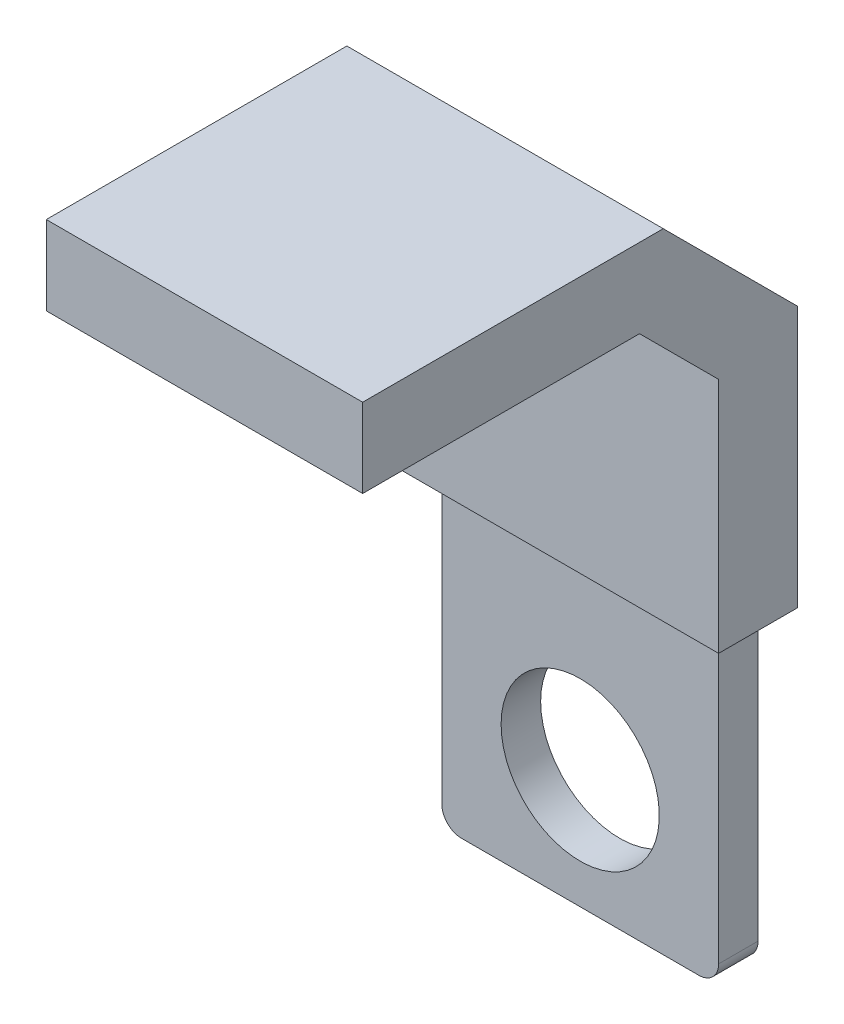
ISO-10303-21;
HEADER;
FILE_DESCRIPTION(('STEP AP214'),'2;1');
FILE_NAME('part.step','',(''),(''),'','','');
FILE_SCHEMA(('AUTOMOTIVE_DESIGN { 1 0 10303 214 1 1 1 1 }'));
ENDSEC;
DATA;
#1=APPLICATION_CONTEXT('core data for automotive mechanical design processes');
#2=APPLICATION_PROTOCOL_DEFINITION('international standard','automotive_design',2000,#1);
#3=PRODUCT_CONTEXT('',#1,'mechanical');
#4=PRODUCT('Part','Part','',(#3));
#5=PRODUCT_RELATED_PRODUCT_CATEGORY('part','',(#4));
#6=PRODUCT_DEFINITION_FORMATION('','',#4);
#7=PRODUCT_DEFINITION_CONTEXT('part definition',#1,'design');
#8=PRODUCT_DEFINITION('design','',#6,#7);
#9=PRODUCT_DEFINITION_SHAPE('','',#8);
#10=(LENGTH_UNIT() NAMED_UNIT(*) SI_UNIT(.MILLI.,.METRE.));
#11=(NAMED_UNIT(*) PLANE_ANGLE_UNIT() SI_UNIT($,.RADIAN.));
#12=(NAMED_UNIT(*) SI_UNIT($,.STERADIAN.) SOLID_ANGLE_UNIT());
#13=UNCERTAINTY_MEASURE_WITH_UNIT(LENGTH_MEASURE(1.E-05),#10,'distance_accuracy_value','');
#14=(GEOMETRIC_REPRESENTATION_CONTEXT(3) GLOBAL_UNCERTAINTY_ASSIGNED_CONTEXT((#13)) GLOBAL_UNIT_ASSIGNED_CONTEXT((#10,
#11,#12)) REPRESENTATION_CONTEXT('',''));
#15=CARTESIAN_POINT('',(0.,0.,0.));
#16=DIRECTION('',(0.,0.,1.));
#17=DIRECTION('',(1.,0.,0.));
#18=AXIS2_PLACEMENT_3D('',#15,#16,#17);
#19=CARTESIAN_POINT('',(-2.,5.,0.5));
#20=DIRECTION('',(0.,0.,-1.));
#21=DIRECTION('',(-1.,0.,0.));
#22=AXIS2_PLACEMENT_3D('',#19,#20,#21);
#23=PLANE('',#22);
#24=DIRECTION('',(0.,-1.,0.));
#25=VECTOR('',#24,1.);
#26=CARTESIAN_POINT('',(2.,5.,0.5));
#27=LINE('',#26,#25);
#28=CARTESIAN_POINT('',(2.,3.,0.5));
#29=VERTEX_POINT('',#28);
#30=CARTESIAN_POINT('',(2.,0.,0.5));
#31=VERTEX_POINT('',#30);
#32=EDGE_CURVE('E188',#29,#31,#27,.T.);
#33=ORIENTED_EDGE('',*,*,#32,.F.);
#34=DIRECTION('',(-1.,0.,0.));
#35=VECTOR('',#34,1.);
#36=CARTESIAN_POINT('',(-2.,3.,0.5));
#37=LINE('',#36,#35);
#38=CARTESIAN_POINT('',(-2.,3.,0.5));
#39=VERTEX_POINT('',#38);
#40=EDGE_CURVE('E196',#29,#39,#37,.T.);
#41=ORIENTED_EDGE('',*,*,#40,.T.);
#42=DIRECTION('',(0.,-1.,0.));
#43=VECTOR('',#42,1.);
#44=CARTESIAN_POINT('',(-2.,5.,0.5));
#45=LINE('',#44,#43);
#46=CARTESIAN_POINT('',(-2.,0.,0.5));
#47=VERTEX_POINT('',#46);
#48=EDGE_CURVE('E185',#39,#47,#45,.T.);
#49=ORIENTED_EDGE('',*,*,#48,.T.);
#50=DIRECTION('',(1.,0.,0.));
#51=VECTOR('',#50,1.);
#52=CARTESIAN_POINT('',(-2.,0.,0.5));
#53=LINE('',#52,#51);
#54=EDGE_CURVE('E173',#47,#31,#53,.T.);
#55=ORIENTED_EDGE('',*,*,#54,.T.);
#56=EDGE_LOOP('',(#33,#41,#49,#55));
#57=FACE_BOUND('',#56,.T.);
#58=ADVANCED_FACE('F33',(#57),#23,.F.);
#59=CARTESIAN_POINT('',(-2.,5.,0.5));
#60=DIRECTION('',(-1.,0.,0.));
#61=DIRECTION('',(0.,0.,1.));
#62=AXIS2_PLACEMENT_3D('',#59,#60,#61);
#63=PLANE('',#62);
#64=DIRECTION('',(0.,0.,-1.));
#65=VECTOR('',#64,1.);
#66=CARTESIAN_POINT('',(-2.,5.,0.5));
#67=LINE('',#66,#65);
#68=CARTESIAN_POINT('',(-2.,5.,5.));
#69=VERTEX_POINT('',#68);
#70=CARTESIAN_POINT('',(-2.,5.,1.20000000000001));
#71=VERTEX_POINT('',#70);
#72=EDGE_CURVE('E145',#69,#71,#67,.T.);
#73=ORIENTED_EDGE('',*,*,#72,.T.);
#74=DIRECTION('',(0.,-0.707106781186546,-0.707106781186549));
#75=VECTOR('',#74,1.);
#76=CARTESIAN_POINT('',(-2.,4.65,0.850000000000002));
#77=LINE('',#76,#75);
#78=CARTESIAN_POINT('',(-2.,3.3,-0.5));
#79=VERTEX_POINT('',#78);
#80=EDGE_CURVE('E208',#71,#79,#77,.T.);
#81=ORIENTED_EDGE('',*,*,#80,.T.);
#82=DIRECTION('',(0.,-1.,0.));
#83=VECTOR('',#82,1.);
#84=CARTESIAN_POINT('',(-2.,5.,-0.5));
#85=LINE('',#84,#83);
#86=CARTESIAN_POINT('',(-2.,0.,-0.5));
#87=VERTEX_POINT('',#86);
#88=EDGE_CURVE('E144',#79,#87,#85,.T.);
#89=ORIENTED_EDGE('',*,*,#88,.T.);
#90=DIRECTION('',(0.,0.,-1.));
#91=VECTOR('',#90,1.);
#92=CARTESIAN_POINT('',(-2.,0.,0.5));
#93=LINE('',#92,#91);
#94=EDGE_CURVE('E172',#47,#87,#93,.T.);
#95=ORIENTED_EDGE('',*,*,#94,.F.);
#96=ORIENTED_EDGE('',*,*,#48,.F.);
#97=DIRECTION('',(0.,-0.707106781186544,-0.707106781186551));
#98=VECTOR('',#97,1.);
#99=CARTESIAN_POINT('',(-2.,4.,1.50000000000001));
#100=LINE('',#99,#98);
#101=CARTESIAN_POINT('',(-2.,4.,1.50000000000001));
#102=VERTEX_POINT('',#101);
#103=EDGE_CURVE('E200',#39,#102,#100,.F.);
#104=ORIENTED_EDGE('',*,*,#103,.T.);
#105=DIRECTION('',(0.,0.,-1.));
#106=VECTOR('',#105,1.);
#107=CARTESIAN_POINT('',(-2.,4.,5.));
#108=LINE('',#107,#106);
#109=CARTESIAN_POINT('',(-2.,4.,5.));
#110=VERTEX_POINT('',#109);
#111=EDGE_CURVE('E169',#110,#102,#108,.T.);
#112=ORIENTED_EDGE('',*,*,#111,.F.);
#113=DIRECTION('',(0.,-1.,0.));
#114=VECTOR('',#113,1.);
#115=CARTESIAN_POINT('',(-2.,5.,5.));
#116=LINE('',#115,#114);
#117=EDGE_CURVE('E153',#69,#110,#116,.T.);
#118=ORIENTED_EDGE('',*,*,#117,.F.);
#119=EDGE_LOOP('',(#73,#81,#89,#95,#96,#104,#112,#118));
#120=FACE_BOUND('',#119,.T.);
#121=ADVANCED_FACE('F304',(#120),#63,.T.);
#122=CARTESIAN_POINT('',(2.,5.,0.5));
#123=DIRECTION('',(-1.,0.,0.));
#124=DIRECTION('',(0.,0.,1.));
#125=AXIS2_PLACEMENT_3D('',#122,#123,#124);
#126=PLANE('',#125);
#127=DIRECTION('',(0.,-1.,0.));
#128=VECTOR('',#127,1.);
#129=CARTESIAN_POINT('',(2.,5.,-0.5));
#130=LINE('',#129,#128);
#131=CARTESIAN_POINT('',(2.,3.3,-0.5));
#132=VERTEX_POINT('',#131);
#133=CARTESIAN_POINT('',(2.,0.,-0.5));
#134=VERTEX_POINT('',#133);
#135=EDGE_CURVE('E190',#132,#134,#130,.T.);
#136=ORIENTED_EDGE('',*,*,#135,.F.);
#137=DIRECTION('',(0.,0.707106781186546,0.707106781186549));
#138=VECTOR('',#137,1.);
#139=CARTESIAN_POINT('',(2.,3.3,-0.5));
#140=LINE('',#139,#138);
#141=CARTESIAN_POINT('',(2.,5.,1.20000000000001));
#142=VERTEX_POINT('',#141);
#143=EDGE_CURVE('E141',#132,#142,#140,.T.);
#144=ORIENTED_EDGE('',*,*,#143,.T.);
#145=DIRECTION('',(0.,0.,-1.));
#146=VECTOR('',#145,1.);
#147=CARTESIAN_POINT('',(2.,5.,0.5));
#148=LINE('',#147,#146);
#149=CARTESIAN_POINT('',(2.,5.,5.));
#150=VERTEX_POINT('',#149);
#151=EDGE_CURVE('E134',#150,#142,#148,.T.);
#152=ORIENTED_EDGE('',*,*,#151,.F.);
#153=DIRECTION('',(0.,1.,0.));
#154=VECTOR('',#153,1.);
#155=CARTESIAN_POINT('',(2.,5.,5.));
#156=LINE('',#155,#154);
#157=CARTESIAN_POINT('',(2.,4.,5.));
#158=VERTEX_POINT('',#157);
#159=EDGE_CURVE('E140',#158,#150,#156,.T.);
#160=ORIENTED_EDGE('',*,*,#159,.F.);
#161=DIRECTION('',(0.,0.,-1.));
#162=VECTOR('',#161,1.);
#163=CARTESIAN_POINT('',(2.,4.,5.));
#164=LINE('',#163,#162);
#165=CARTESIAN_POINT('',(2.,4.,1.50000000000001));
#166=VERTEX_POINT('',#165);
#167=EDGE_CURVE('E167',#158,#166,#164,.T.);
#168=ORIENTED_EDGE('',*,*,#167,.T.);
#169=DIRECTION('',(0.,0.707106781186544,0.707106781186551));
#170=VECTOR('',#169,1.);
#171=CARTESIAN_POINT('',(2.,3.99999999999999,1.5));
#172=LINE('',#171,#170);
#173=EDGE_CURVE('E198',#166,#29,#172,.F.);
#174=ORIENTED_EDGE('',*,*,#173,.T.);
#175=ORIENTED_EDGE('',*,*,#32,.T.);
#176=DIRECTION('',(0.,0.,-1.));
#177=VECTOR('',#176,1.);
#178=CARTESIAN_POINT('',(2.,0.,0.5));
#179=LINE('',#178,#177);
#180=EDGE_CURVE('E180',#31,#134,#179,.T.);
#181=ORIENTED_EDGE('',*,*,#180,.T.);
#182=EDGE_LOOP('',(#136,#144,#152,#160,#168,#174,#175,#181));
#183=FACE_BOUND('',#182,.T.);
#184=ADVANCED_FACE('F137',(#183),#126,.F.);
#185=CARTESIAN_POINT('',(-2.,5.,-0.5));
#186=DIRECTION('',(0.,0.,-1.));
#187=DIRECTION('',(-1.,0.,0.));
#188=AXIS2_PLACEMENT_3D('',#185,#186,#187);
#189=PLANE('',#188);
#190=ORIENTED_EDGE('',*,*,#88,.F.);
#191=DIRECTION('',(1.,0.,0.));
#192=VECTOR('',#191,1.);
#193=CARTESIAN_POINT('',(2.,3.3,-0.5));
#194=LINE('',#193,#192);
#195=EDGE_CURVE('E202',#79,#132,#194,.T.);
#196=ORIENTED_EDGE('',*,*,#195,.T.);
#197=ORIENTED_EDGE('',*,*,#135,.T.);
#198=DIRECTION('',(1.,0.,0.));
#199=VECTOR('',#198,1.);
#200=CARTESIAN_POINT('',(-2.,0.,-0.5));
#201=LINE('',#200,#199);
#202=EDGE_CURVE('E177',#87,#134,#201,.T.);
#203=ORIENTED_EDGE('',*,*,#202,.F.);
#204=EDGE_LOOP('',(#190,#196,#197,#203));
#205=FACE_BOUND('',#204,.T.);
#206=ADVANCED_FACE('F318',(#205),#189,.T.);
#207=CARTESIAN_POINT('',(0.,5.,0.));
#208=DIRECTION('',(0.,-1.,0.));
#209=DIRECTION('',(0.,0.,-1.));
#210=AXIS2_PLACEMENT_3D('',#207,#208,#209);
#211=PLANE('',#210);
#212=ORIENTED_EDGE('',*,*,#151,.T.);
#213=DIRECTION('',(-1.,0.,0.));
#214=VECTOR('',#213,1.);
#215=CARTESIAN_POINT('',(-2.,5.,1.20000000000001));
#216=LINE('',#215,#214);
#217=EDGE_CURVE('E206',#142,#71,#216,.T.);
#218=ORIENTED_EDGE('',*,*,#217,.T.);
#219=ORIENTED_EDGE('',*,*,#72,.F.);
#220=DIRECTION('',(-1.,0.,0.));
#221=VECTOR('',#220,1.);
#222=CARTESIAN_POINT('',(2.,5.,5.));
#223=LINE('',#222,#221);
#224=EDGE_CURVE('E148',#150,#69,#223,.T.);
#225=ORIENTED_EDGE('',*,*,#224,.F.);
#226=EDGE_LOOP('',(#212,#218,#219,#225));
#227=FACE_BOUND('',#226,.T.);
#228=ADVANCED_FACE('F149',(#227),#211,.F.);
#229=CARTESIAN_POINT('',(2.,4.,5.));
#230=DIRECTION('',(0.,1.,0.));
#231=DIRECTION('',(0.,0.,1.));
#232=AXIS2_PLACEMENT_3D('',#229,#230,#231);
#233=PLANE('',#232);
#234=ORIENTED_EDGE('',*,*,#111,.T.);
#235=DIRECTION('',(1.,0.,0.));
#236=VECTOR('',#235,1.);
#237=CARTESIAN_POINT('',(2.,4.,1.50000000000001));
#238=LINE('',#237,#236);
#239=EDGE_CURVE('E187',#102,#166,#238,.T.);
#240=ORIENTED_EDGE('',*,*,#239,.T.);
#241=ORIENTED_EDGE('',*,*,#167,.F.);
#242=DIRECTION('',(1.,0.,0.));
#243=VECTOR('',#242,1.);
#244=CARTESIAN_POINT('',(2.,4.,5.));
#245=LINE('',#244,#243);
#246=EDGE_CURVE('E157',#110,#158,#245,.T.);
#247=ORIENTED_EDGE('',*,*,#246,.F.);
#248=EDGE_LOOP('',(#234,#240,#241,#247));
#249=FACE_BOUND('',#248,.T.);
#250=ADVANCED_FACE('F426',(#249),#233,.F.);
#251=CARTESIAN_POINT('',(0.,0.,5.));
#252=DIRECTION('',(0.,0.,-1.));
#253=DIRECTION('',(-1.,0.,0.));
#254=AXIS2_PLACEMENT_3D('',#251,#252,#253);
#255=PLANE('',#254);
#256=ORIENTED_EDGE('',*,*,#159,.T.);
#257=ORIENTED_EDGE('',*,*,#224,.T.);
#258=ORIENTED_EDGE('',*,*,#117,.T.);
#259=ORIENTED_EDGE('',*,*,#246,.T.);
#260=EDGE_LOOP('',(#256,#257,#258,#259));
#261=FACE_BOUND('',#260,.T.);
#262=ADVANCED_FACE('F155',(#261),#255,.F.);
#263=CARTESIAN_POINT('',(2.,4.,1.50000000000001));
#264=DIRECTION('',(0.,-0.707106781186551,0.707106781186544));
#265=DIRECTION('',(-1.,0.,0.));
#266=AXIS2_PLACEMENT_3D('',#263,#264,#265);
#267=PLANE('',#266);
#268=ORIENTED_EDGE('',*,*,#103,.F.);
#269=ORIENTED_EDGE('',*,*,#40,.F.);
#270=ORIENTED_EDGE('',*,*,#173,.F.);
#271=ORIENTED_EDGE('',*,*,#239,.F.);
#272=EDGE_LOOP('',(#268,#269,#270,#271));
#273=FACE_BOUND('',#272,.T.);
#274=ADVANCED_FACE('F322',(#273),#267,.T.);
#275=CARTESIAN_POINT('',(-2.,3.3,-0.5));
#276=DIRECTION('',(0.,0.707106781186549,-0.707106781186546));
#277=DIRECTION('',(-1.,0.,0.));
#278=AXIS2_PLACEMENT_3D('',#275,#276,#277);
#279=PLANE('',#278);
#280=ORIENTED_EDGE('',*,*,#80,.F.);
#281=ORIENTED_EDGE('',*,*,#217,.F.);
#282=ORIENTED_EDGE('',*,*,#143,.F.);
#283=ORIENTED_EDGE('',*,*,#195,.F.);
#284=EDGE_LOOP('',(#280,#281,#282,#283));
#285=FACE_BOUND('',#284,.T.);
#286=ADVANCED_FACE('F301',(#285),#279,.T.);
#287=CARTESIAN_POINT('',(-1.75,-3.9,-0.25));
#288=DIRECTION('',(1.,0.,0.));
#289=DIRECTION('',(0.,0.,-1.));
#290=AXIS2_PLACEMENT_3D('',#287,#288,#289);
#291=PLANE('',#290);
#292=DIRECTION('',(0.,1.,0.));
#293=VECTOR('',#292,1.);
#294=CARTESIAN_POINT('',(-1.75,-3.9,-0.25));
#295=LINE('',#294,#293);
#296=CARTESIAN_POINT('',(-1.75,-3.65,-0.25));
#297=VERTEX_POINT('',#296);
#298=CARTESIAN_POINT('',(-1.75,-0.25,-0.25));
#299=VERTEX_POINT('',#298);
#300=EDGE_CURVE('E159',#297,#299,#295,.T.);
#301=ORIENTED_EDGE('',*,*,#300,.F.);
#302=DIRECTION('',(0.,0.,-1.));
#303=VECTOR('',#302,1.);
#304=CARTESIAN_POINT('',(-1.75,-3.65,0.25));
#305=LINE('',#304,#303);
#306=CARTESIAN_POINT('',(-1.75,-3.65,0.25));
#307=VERTEX_POINT('',#306);
#308=EDGE_CURVE('E56',#297,#307,#305,.F.);
#309=ORIENTED_EDGE('',*,*,#308,.T.);
#310=DIRECTION('',(0.,1.,0.));
#311=VECTOR('',#310,1.);
#312=CARTESIAN_POINT('',(-1.75,-3.9,0.25));
#313=LINE('',#312,#311);
#314=CARTESIAN_POINT('',(-1.75,-0.25,0.25));
#315=VERTEX_POINT('',#314);
#316=EDGE_CURVE('E253',#307,#315,#313,.T.);
#317=ORIENTED_EDGE('',*,*,#316,.T.);
#318=DIRECTION('',(0.,0.,-1.));
#319=VECTOR('',#318,1.);
#320=CARTESIAN_POINT('',(-1.75,-0.25,-0.25));
#321=LINE('',#320,#319);
#322=EDGE_CURVE('E216',#315,#299,#321,.T.);
#323=ORIENTED_EDGE('',*,*,#322,.T.);
#324=EDGE_LOOP('',(#301,#309,#317,#323));
#325=FACE_BOUND('',#324,.T.);
#326=ADVANCED_FACE('F265',(#325),#291,.F.);
#327=CARTESIAN_POINT('',(1.75,-3.9,-0.25));
#328=DIRECTION('',(0.,0.,1.));
#329=DIRECTION('',(1.,0.,0.));
#330=AXIS2_PLACEMENT_3D('',#327,#328,#329);
#331=PLANE('',#330);
#332=CARTESIAN_POINT('',(0.,-2.4007630448466,-0.25));
#333=DIRECTION('',(0.,0.,-1.));
#334=DIRECTION('',(-1.,0.,0.));
#335=AXIS2_PLACEMENT_3D('',#332,#333,#334);
#336=CIRCLE('',#335,1.);
#337=CARTESIAN_POINT('',(-1.,-2.4007630448466,-0.25));
#338=VERTEX_POINT('',#337);
#339=EDGE_CURVE('E238',#338,#338,#336,.T.);
#340=ORIENTED_EDGE('',*,*,#339,.F.);
#341=EDGE_LOOP('',(#340));
#342=FACE_BOUND('',#341,.T.);
#343=DIRECTION('',(1.,0.,0.));
#344=VECTOR('',#343,1.);
#345=CARTESIAN_POINT('',(1.75,-3.9,-0.25));
#346=LINE('',#345,#344);
#347=CARTESIAN_POINT('',(-1.5,-3.9,-0.25));
#348=VERTEX_POINT('',#347);
#349=CARTESIAN_POINT('',(1.5,-3.9,-0.25));
#350=VERTEX_POINT('',#349);
#351=EDGE_CURVE('E235',#348,#350,#346,.T.);
#352=ORIENTED_EDGE('',*,*,#351,.F.);
#353=CARTESIAN_POINT('',(-1.5,-3.65,-0.25));
#354=DIRECTION('',(0.,0.,1.));
#355=DIRECTION('',(1.,0.,0.));
#356=AXIS2_PLACEMENT_3D('',#353,#354,#355);
#357=CIRCLE('',#356,0.25);
#358=EDGE_CURVE('E246',#348,#297,#357,.F.);
#359=ORIENTED_EDGE('',*,*,#358,.T.);
#360=ORIENTED_EDGE('',*,*,#300,.T.);
#361=DIRECTION('',(1.,0.,0.));
#362=VECTOR('',#361,1.);
#363=CARTESIAN_POINT('',(1.75,-0.25,-0.25));
#364=LINE('',#363,#362);
#365=CARTESIAN_POINT('',(1.75,-0.25,-0.25));
#366=VERTEX_POINT('',#365);
#367=EDGE_CURVE('E213',#299,#366,#364,.T.);
#368=ORIENTED_EDGE('',*,*,#367,.T.);
#369=DIRECTION('',(0.,1.,0.));
#370=VECTOR('',#369,1.);
#371=CARTESIAN_POINT('',(1.75,-3.9,-0.25));
#372=LINE('',#371,#370);
#373=CARTESIAN_POINT('',(1.75,-3.65,-0.25));
#374=VERTEX_POINT('',#373);
#375=EDGE_CURVE('E161',#374,#366,#372,.T.);
#376=ORIENTED_EDGE('',*,*,#375,.F.);
#377=CARTESIAN_POINT('',(1.5,-3.65,-0.25));
#378=DIRECTION('',(0.,0.,1.));
#379=DIRECTION('',(1.,0.,0.));
#380=AXIS2_PLACEMENT_3D('',#377,#378,#379);
#381=CIRCLE('',#380,0.25);
#382=EDGE_CURVE('E244',#374,#350,#381,.F.);
#383=ORIENTED_EDGE('',*,*,#382,.T.);
#384=EDGE_LOOP('',(#352,#359,#360,#368,#376,#383));
#385=FACE_BOUND('',#384,.T.);
#386=ADVANCED_FACE('F264',(#342,#385),#331,.F.);
#387=CARTESIAN_POINT('',(1.75,-3.9,-0.25));
#388=DIRECTION('',(-1.,0.,0.));
#389=DIRECTION('',(0.,0.,1.));
#390=AXIS2_PLACEMENT_3D('',#387,#388,#389);
#391=PLANE('',#390);
#392=DIRECTION('',(0.,1.,0.));
#393=VECTOR('',#392,1.);
#394=CARTESIAN_POINT('',(1.75,-3.9,0.25));
#395=LINE('',#394,#393);
#396=CARTESIAN_POINT('',(1.75,-3.65,0.25));
#397=VERTEX_POINT('',#396);
#398=CARTESIAN_POINT('',(1.75,-0.25,0.25));
#399=VERTEX_POINT('',#398);
#400=EDGE_CURVE('E280',#397,#399,#395,.T.);
#401=ORIENTED_EDGE('',*,*,#400,.F.);
#402=DIRECTION('',(0.,0.,1.));
#403=VECTOR('',#402,1.);
#404=CARTESIAN_POINT('',(1.75,-3.65,-0.25));
#405=LINE('',#404,#403);
#406=EDGE_CURVE('E11',#397,#374,#405,.F.);
#407=ORIENTED_EDGE('',*,*,#406,.T.);
#408=ORIENTED_EDGE('',*,*,#375,.T.);
#409=DIRECTION('',(0.,0.,1.));
#410=VECTOR('',#409,1.);
#411=CARTESIAN_POINT('',(1.75,-0.25,-0.25));
#412=LINE('',#411,#410);
#413=EDGE_CURVE('E210',#366,#399,#412,.T.);
#414=ORIENTED_EDGE('',*,*,#413,.T.);
#415=EDGE_LOOP('',(#401,#407,#408,#414));
#416=FACE_BOUND('',#415,.T.);
#417=ADVANCED_FACE('F283',(#416),#391,.F.);
#418=CARTESIAN_POINT('',(1.75,-3.9,0.25));
#419=DIRECTION('',(0.,0.,-1.));
#420=DIRECTION('',(-1.,0.,0.));
#421=AXIS2_PLACEMENT_3D('',#418,#419,#420);
#422=PLANE('',#421);
#423=CARTESIAN_POINT('',(0.,-2.4007630448466,0.25));
#424=DIRECTION('',(0.,0.,-1.));
#425=DIRECTION('',(-1.,0.,0.));
#426=AXIS2_PLACEMENT_3D('',#423,#424,#425);
#427=CIRCLE('',#426,1.);
#428=CARTESIAN_POINT('',(-1.,-2.4007630448466,0.25));
#429=VERTEX_POINT('',#428);
#430=EDGE_CURVE('E227',#429,#429,#427,.T.);
#431=ORIENTED_EDGE('',*,*,#430,.T.);
#432=EDGE_LOOP('',(#431));
#433=FACE_BOUND('',#432,.T.);
#434=ORIENTED_EDGE('',*,*,#316,.F.);
#435=CARTESIAN_POINT('',(-1.5,-3.65,0.25));
#436=DIRECTION('',(0.,0.,-1.));
#437=DIRECTION('',(-1.,0.,0.));
#438=AXIS2_PLACEMENT_3D('',#435,#436,#437);
#439=CIRCLE('',#438,0.25);
#440=CARTESIAN_POINT('',(-1.5,-3.9,0.25));
#441=VERTEX_POINT('',#440);
#442=EDGE_CURVE('E41',#307,#441,#439,.F.);
#443=ORIENTED_EDGE('',*,*,#442,.T.);
#444=DIRECTION('',(-1.,0.,0.));
#445=VECTOR('',#444,1.);
#446=CARTESIAN_POINT('',(1.75,-3.9,0.25));
#447=LINE('',#446,#445);
#448=CARTESIAN_POINT('',(1.5,-3.9,0.25));
#449=VERTEX_POINT('',#448);
#450=EDGE_CURVE('E252',#449,#441,#447,.T.);
#451=ORIENTED_EDGE('',*,*,#450,.F.);
#452=CARTESIAN_POINT('',(1.5,-3.65,0.25));
#453=DIRECTION('',(0.,0.,-1.));
#454=DIRECTION('',(-1.,0.,0.));
#455=AXIS2_PLACEMENT_3D('',#452,#453,#454);
#456=CIRCLE('',#455,0.25);
#457=EDGE_CURVE('E48',#449,#397,#456,.F.);
#458=ORIENTED_EDGE('',*,*,#457,.T.);
#459=ORIENTED_EDGE('',*,*,#400,.T.);
#460=DIRECTION('',(-1.,0.,0.));
#461=VECTOR('',#460,1.);
#462=CARTESIAN_POINT('',(1.75,-0.25,0.25));
#463=LINE('',#462,#461);
#464=EDGE_CURVE('E219',#399,#315,#463,.T.);
#465=ORIENTED_EDGE('',*,*,#464,.T.);
#466=EDGE_LOOP('',(#434,#443,#451,#458,#459,#465));
#467=FACE_BOUND('',#466,.T.);
#468=ADVANCED_FACE('F251',(#433,#467),#422,.F.);
#469=CARTESIAN_POINT('',(0.,-3.9,0.));
#470=DIRECTION('',(0.,-1.,0.));
#471=DIRECTION('',(0.,0.,-1.));
#472=AXIS2_PLACEMENT_3D('',#469,#470,#471);
#473=PLANE('',#472);
#474=ORIENTED_EDGE('',*,*,#450,.T.);
#475=DIRECTION('',(0.,0.,-1.));
#476=VECTOR('',#475,1.);
#477=CARTESIAN_POINT('',(-1.5,-3.9,-0.25));
#478=LINE('',#477,#476);
#479=EDGE_CURVE('E241',#441,#348,#478,.T.);
#480=ORIENTED_EDGE('',*,*,#479,.T.);
#481=ORIENTED_EDGE('',*,*,#351,.T.);
#482=DIRECTION('',(0.,0.,1.));
#483=VECTOR('',#482,1.);
#484=CARTESIAN_POINT('',(1.5,-3.9,0.25));
#485=LINE('',#484,#483);
#486=EDGE_CURVE('E222',#350,#449,#485,.T.);
#487=ORIENTED_EDGE('',*,*,#486,.T.);
#488=EDGE_LOOP('',(#474,#480,#481,#487));
#489=FACE_BOUND('',#488,.T.);
#490=ADVANCED_FACE('F257',(#489),#473,.T.);
#491=CARTESIAN_POINT('',(-2.,-0.25,-0.25));
#492=DIRECTION('',(0.,0.,-1.));
#493=DIRECTION('',(-1.,0.,0.));
#494=AXIS2_PLACEMENT_3D('',#491,#492,#493);
#495=CYLINDRICAL_SURFACE('',#494,0.25);
#496=CARTESIAN_POINT('',(-2.,-0.25,0.5));
#497=DIRECTION('',(-0.707106781186547,0.,-0.707106781186548));
#498=DIRECTION('',(-0.707106781186548,0.,0.707106781186547));
#499=AXIS2_PLACEMENT_3D('',#496,#497,#498);
#500=ELLIPSE('',#499,0.353553390593274,0.25);
#501=EDGE_CURVE('E229',#47,#315,#500,.T.);
#502=ORIENTED_EDGE('',*,*,#501,.F.);
#503=ORIENTED_EDGE('',*,*,#94,.T.);
#504=CARTESIAN_POINT('',(-2.,-0.25,-0.5));
#505=DIRECTION('',(0.707106781186548,0.,-0.707106781186547));
#506=DIRECTION('',(-0.707106781186547,0.,-0.707106781186547));
#507=AXIS2_PLACEMENT_3D('',#504,#505,#506);
#508=ELLIPSE('',#507,0.353553390593274,0.25);
#509=EDGE_CURVE('E232',#299,#87,#508,.F.);
#510=ORIENTED_EDGE('',*,*,#509,.F.);
#511=ORIENTED_EDGE('',*,*,#322,.F.);
#512=EDGE_LOOP('',(#502,#503,#510,#511));
#513=FACE_BOUND('',#512,.T.);
#514=ADVANCED_FACE('F271',(#513),#495,.F.);
#515=CARTESIAN_POINT('',(1.75,-0.25,-0.5));
#516=DIRECTION('',(1.,0.,0.));
#517=DIRECTION('',(0.,0.,-1.));
#518=AXIS2_PLACEMENT_3D('',#515,#516,#517);
#519=CYLINDRICAL_SURFACE('',#518,0.25);
#520=ORIENTED_EDGE('',*,*,#509,.T.);
#521=ORIENTED_EDGE('',*,*,#202,.T.);
#522=CARTESIAN_POINT('',(2.,-0.25,-0.5));
#523=DIRECTION('',(0.707106781186547,0.,0.707106781186547));
#524=DIRECTION('',(0.707106781186548,0.,-0.707106781186547));
#525=AXIS2_PLACEMENT_3D('',#522,#523,#524);
#526=ELLIPSE('',#525,0.353553390593274,0.25);
#527=EDGE_CURVE('E226',#366,#134,#526,.F.);
#528=ORIENTED_EDGE('',*,*,#527,.F.);
#529=ORIENTED_EDGE('',*,*,#367,.F.);
#530=EDGE_LOOP('',(#520,#521,#528,#529));
#531=FACE_BOUND('',#530,.T.);
#532=ADVANCED_FACE('F275',(#531),#519,.F.);
#533=CARTESIAN_POINT('',(1.75,-0.25,0.5));
#534=DIRECTION('',(-1.,0.,0.));
#535=DIRECTION('',(0.,0.,1.));
#536=AXIS2_PLACEMENT_3D('',#533,#534,#535);
#537=CYLINDRICAL_SURFACE('',#536,0.25);
#538=ORIENTED_EDGE('',*,*,#501,.T.);
#539=ORIENTED_EDGE('',*,*,#464,.F.);
#540=CARTESIAN_POINT('',(2.,-0.25,0.5));
#541=DIRECTION('',(-0.707106781186548,0.,0.707106781186547));
#542=DIRECTION('',(-0.707106781186547,0.,-0.707106781186548));
#543=AXIS2_PLACEMENT_3D('',#540,#541,#542);
#544=ELLIPSE('',#543,0.353553390593274,0.25);
#545=EDGE_CURVE('E223',#31,#399,#544,.T.);
#546=ORIENTED_EDGE('',*,*,#545,.F.);
#547=ORIENTED_EDGE('',*,*,#54,.F.);
#548=EDGE_LOOP('',(#538,#539,#546,#547));
#549=FACE_BOUND('',#548,.T.);
#550=ADVANCED_FACE('F332',(#549),#537,.F.);
#551=CARTESIAN_POINT('',(2.,-0.25,-0.25));
#552=DIRECTION('',(0.,0.,1.));
#553=DIRECTION('',(1.,0.,0.));
#554=AXIS2_PLACEMENT_3D('',#551,#552,#553);
#555=CYLINDRICAL_SURFACE('',#554,0.25);
#556=ORIENTED_EDGE('',*,*,#527,.T.);
#557=ORIENTED_EDGE('',*,*,#180,.F.);
#558=ORIENTED_EDGE('',*,*,#545,.T.);
#559=ORIENTED_EDGE('',*,*,#413,.F.);
#560=EDGE_LOOP('',(#556,#557,#558,#559));
#561=FACE_BOUND('',#560,.T.);
#562=ADVANCED_FACE('F329',(#561),#555,.F.);
#563=CARTESIAN_POINT('',(0.,-2.4007630448466,3.65));
#564=DIRECTION('',(0.,0.,-1.));
#565=DIRECTION('',(-1.,0.,0.));
#566=AXIS2_PLACEMENT_3D('',#563,#564,#565);
#567=CYLINDRICAL_SURFACE('',#566,1.);
#568=ORIENTED_EDGE('',*,*,#339,.T.);
#569=EDGE_LOOP('',(#568));
#570=FACE_BOUND('',#569,.T.);
#571=ORIENTED_EDGE('',*,*,#430,.F.);
#572=EDGE_LOOP('',(#571));
#573=FACE_BOUND('',#572,.T.);
#574=ADVANCED_FACE('F291',(#570,#573),#567,.F.);
#575=CARTESIAN_POINT('',(-1.5,-3.65,0.));
#576=DIRECTION('',(0.,0.,1.));
#577=DIRECTION('',(1.,0.,0.));
#578=AXIS2_PLACEMENT_3D('',#575,#576,#577);
#579=CYLINDRICAL_SURFACE('',#578,0.25);
#580=ORIENTED_EDGE('',*,*,#442,.F.);
#581=ORIENTED_EDGE('',*,*,#308,.F.);
#582=ORIENTED_EDGE('',*,*,#358,.F.);
#583=ORIENTED_EDGE('',*,*,#479,.F.);
#584=EDGE_LOOP('',(#580,#581,#582,#583));
#585=FACE_BOUND('',#584,.T.);
#586=ADVANCED_FACE('F262',(#585),#579,.T.);
#587=CARTESIAN_POINT('',(1.5,-3.65,0.));
#588=DIRECTION('',(0.,0.,-1.));
#589=DIRECTION('',(-1.,0.,0.));
#590=AXIS2_PLACEMENT_3D('',#587,#588,#589);
#591=CYLINDRICAL_SURFACE('',#590,0.25);
#592=ORIENTED_EDGE('',*,*,#382,.F.);
#593=ORIENTED_EDGE('',*,*,#406,.F.);
#594=ORIENTED_EDGE('',*,*,#457,.F.);
#595=ORIENTED_EDGE('',*,*,#486,.F.);
#596=EDGE_LOOP('',(#592,#593,#594,#595));
#597=FACE_BOUND('',#596,.T.);
#598=ADVANCED_FACE('F35',(#597),#591,.T.);
#599=CLOSED_SHELL('',(#58,#121,#184,#206,#228,#250,#262,#274,#286,#326,#386,#417,#468,#490,#514,
#532,#550,#562,#574,#586,#598));
#600=MANIFOLD_SOLID_BREP('B2',#599);
#601=ADVANCED_BREP_SHAPE_REPRESENTATION('',(#18,#600),#14);
#602=SHAPE_DEFINITION_REPRESENTATION(#9,#601);
ENDSEC;
END-ISO-10303-21;
